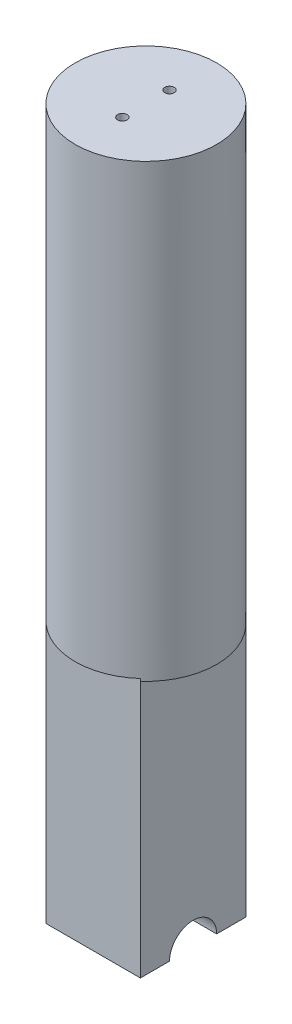
ISO-10303-21;
HEADER;
FILE_DESCRIPTION(('STEP AP214'),'2;1');
FILE_NAME('part.step','',(''),(''),'','','');
FILE_SCHEMA(('AUTOMOTIVE_DESIGN { 1 0 10303 214 1 1 1 1 }'));
ENDSEC;
DATA;
#1=APPLICATION_CONTEXT('core data for automotive mechanical design processes');
#2=APPLICATION_PROTOCOL_DEFINITION('international standard','automotive_design',2000,#1);
#3=PRODUCT_CONTEXT('',#1,'mechanical');
#4=PRODUCT('Part','Part','',(#3));
#5=PRODUCT_RELATED_PRODUCT_CATEGORY('part','',(#4));
#6=PRODUCT_DEFINITION_FORMATION('','',#4);
#7=PRODUCT_DEFINITION_CONTEXT('part definition',#1,'design');
#8=PRODUCT_DEFINITION('design','',#6,#7);
#9=PRODUCT_DEFINITION_SHAPE('','',#8);
#10=(LENGTH_UNIT() NAMED_UNIT(*) SI_UNIT(.MILLI.,.METRE.));
#11=(NAMED_UNIT(*) PLANE_ANGLE_UNIT() SI_UNIT($,.RADIAN.));
#12=(NAMED_UNIT(*) SI_UNIT($,.STERADIAN.) SOLID_ANGLE_UNIT());
#13=UNCERTAINTY_MEASURE_WITH_UNIT(LENGTH_MEASURE(1.E-05),#10,'distance_accuracy_value','');
#14=(GEOMETRIC_REPRESENTATION_CONTEXT(3) GLOBAL_UNCERTAINTY_ASSIGNED_CONTEXT((#13)) GLOBAL_UNIT_ASSIGNED_CONTEXT((#10,
#11,#12)) REPRESENTATION_CONTEXT('',''));
#15=CARTESIAN_POINT('',(0.,0.,0.));
#16=DIRECTION('',(0.,0.,1.));
#17=DIRECTION('',(1.,0.,0.));
#18=AXIS2_PLACEMENT_3D('',#15,#16,#17);
#19=CARTESIAN_POINT('',(0.,0.,0.));
#20=DIRECTION('',(0.,1.,0.));
#21=DIRECTION('',(0.,0.,1.));
#22=AXIS2_PLACEMENT_3D('',#19,#20,#21);
#23=PLANE('',#22);
#24=DIRECTION('',(0.,0.,1.));
#25=VECTOR('',#24,1.);
#26=CARTESIAN_POINT('',(-10.,0.,0.));
#27=LINE('',#26,#25);
#28=CARTESIAN_POINT('',(-10.,0.,4.99966011250106));
#29=VERTEX_POINT('',#28);
#30=CARTESIAN_POINT('',(-10.,0.,11.1803398874989));
#31=VERTEX_POINT('',#30);
#32=EDGE_CURVE('E129',#29,#31,#27,.T.);
#33=ORIENTED_EDGE('',*,*,#32,.F.);
#34=DIRECTION('',(1.,0.,0.));
#35=VECTOR('',#34,1.);
#36=CARTESIAN_POINT('',(-15.,0.,4.99966011250106));
#37=LINE('',#36,#35);
#38=CARTESIAN_POINT('',(10.,0.,4.99966011250106));
#39=VERTEX_POINT('',#38);
#40=EDGE_CURVE('E58',#29,#39,#37,.T.);
#41=ORIENTED_EDGE('',*,*,#40,.T.);
#42=DIRECTION('',(0.,0.,1.));
#43=VECTOR('',#42,1.);
#44=CARTESIAN_POINT('',(10.,0.,0.));
#45=LINE('',#44,#43);
#46=CARTESIAN_POINT('',(10.,0.,11.1803398874989));
#47=VERTEX_POINT('',#46);
#48=EDGE_CURVE('E122',#39,#47,#45,.T.);
#49=ORIENTED_EDGE('',*,*,#48,.T.);
#50=DIRECTION('',(1.,0.,0.));
#51=VECTOR('',#50,1.);
#52=CARTESIAN_POINT('',(-10.,0.,11.1803398874989));
#53=LINE('',#52,#51);
#54=EDGE_CURVE('E252',#31,#47,#53,.T.);
#55=ORIENTED_EDGE('',*,*,#54,.F.);
#56=EDGE_LOOP('',(#33,#41,#49,#55));
#57=FACE_BOUND('',#56,.T.);
#58=ADVANCED_FACE('F44',(#57),#23,.F.);
#59=CARTESIAN_POINT('',(0.,150.,0.));
#60=DIRECTION('',(0.,-1.,0.));
#61=DIRECTION('',(0.,0.,-1.));
#62=AXIS2_PLACEMENT_3D('',#59,#60,#61);
#63=CYLINDRICAL_SURFACE('',#62,15.);
#64=CARTESIAN_POINT('',(0.,150.,0.));
#65=DIRECTION('',(0.,1.,0.));
#66=DIRECTION('',(0.,0.,1.));
#67=AXIS2_PLACEMENT_3D('',#64,#65,#66);
#68=CIRCLE('',#67,15.);
#69=CARTESIAN_POINT('',(0.,150.,15.));
#70=VERTEX_POINT('',#69);
#71=EDGE_CURVE('E131',#70,#70,#68,.T.);
#72=ORIENTED_EDGE('',*,*,#71,.F.);
#73=EDGE_LOOP('',(#72));
#74=FACE_BOUND('',#73,.T.);
#75=CARTESIAN_POINT('',(0.,55.,0.));
#76=DIRECTION('',(0.,-1.,0.));
#77=DIRECTION('',(0.,0.,-1.));
#78=AXIS2_PLACEMENT_3D('',#75,#76,#77);
#79=CIRCLE('',#78,15.);
#80=CARTESIAN_POINT('',(-10.,55.,-11.1803398874989));
#81=VERTEX_POINT('',#80);
#82=CARTESIAN_POINT('',(10.,55.,-11.1803398874989));
#83=VERTEX_POINT('',#82);
#84=EDGE_CURVE('E247',#81,#83,#79,.T.);
#85=ORIENTED_EDGE('',*,*,#84,.F.);
#86=DIRECTION('',(0.,-1.,0.));
#87=VECTOR('',#86,1.);
#88=CARTESIAN_POINT('',(-10.,55.,-11.1803398874989));
#89=LINE('',#88,#87);
#90=CARTESIAN_POINT('',(-10.,54.4943570603394,-11.1803398874989));
#91=VERTEX_POINT('',#90);
#92=EDGE_CURVE('E144',#81,#91,#89,.T.);
#93=ORIENTED_EDGE('',*,*,#92,.T.);
#94=CARTESIAN_POINT('',(0.,54.4943570603394,0.));
#95=DIRECTION('',(0.,1.,0.));
#96=DIRECTION('',(0.,0.,1.));
#97=AXIS2_PLACEMENT_3D('',#94,#95,#96);
#98=CIRCLE('',#97,15.);
#99=CARTESIAN_POINT('',(-10.,54.4943570603394,11.1803398874989));
#100=VERTEX_POINT('',#99);
#101=EDGE_CURVE('E52',#91,#100,#98,.T.);
#102=ORIENTED_EDGE('',*,*,#101,.T.);
#103=DIRECTION('',(0.,-1.,0.));
#104=VECTOR('',#103,1.);
#105=CARTESIAN_POINT('',(-10.,55.,11.1803398874989));
#106=LINE('',#105,#104);
#107=CARTESIAN_POINT('',(-10.,55.,11.1803398874989));
#108=VERTEX_POINT('',#107);
#109=EDGE_CURVE('E143',#108,#100,#106,.T.);
#110=ORIENTED_EDGE('',*,*,#109,.F.);
#111=CARTESIAN_POINT('',(0.,55.,0.));
#112=DIRECTION('',(0.,-1.,0.));
#113=DIRECTION('',(0.,0.,-1.));
#114=AXIS2_PLACEMENT_3D('',#111,#112,#113);
#115=CIRCLE('',#114,15.);
#116=CARTESIAN_POINT('',(10.,55.,11.1803398874989));
#117=VERTEX_POINT('',#116);
#118=EDGE_CURVE('E161',#117,#108,#115,.T.);
#119=ORIENTED_EDGE('',*,*,#118,.F.);
#120=DIRECTION('',(0.,-1.,0.));
#121=VECTOR('',#120,1.);
#122=CARTESIAN_POINT('',(10.,55.,11.1803398874989));
#123=LINE('',#122,#121);
#124=CARTESIAN_POINT('',(10.,54.4943570603394,11.1803398874989));
#125=VERTEX_POINT('',#124);
#126=EDGE_CURVE('E246',#117,#125,#123,.T.);
#127=ORIENTED_EDGE('',*,*,#126,.T.);
#128=CARTESIAN_POINT('',(0.,54.4943570603394,0.));
#129=DIRECTION('',(0.,-1.,0.));
#130=DIRECTION('',(0.,0.,-1.));
#131=AXIS2_PLACEMENT_3D('',#128,#129,#130);
#132=CIRCLE('',#131,15.);
#133=CARTESIAN_POINT('',(10.,54.4943570603394,-11.1803398874989));
#134=VERTEX_POINT('',#133);
#135=EDGE_CURVE('E126',#134,#125,#132,.T.);
#136=ORIENTED_EDGE('',*,*,#135,.F.);
#137=DIRECTION('',(0.,-1.,0.));
#138=VECTOR('',#137,1.);
#139=CARTESIAN_POINT('',(10.,55.,-11.1803398874989));
#140=LINE('',#139,#138);
#141=EDGE_CURVE('E158',#83,#134,#140,.T.);
#142=ORIENTED_EDGE('',*,*,#141,.F.);
#143=EDGE_LOOP('',(#85,#93,#102,#110,#119,#127,#136,#142));
#144=FACE_BOUND('',#143,.T.);
#145=ADVANCED_FACE('F46',(#74,#144),#63,.T.);
#146=CARTESIAN_POINT('',(10.,0.,-11.1803398874989));
#147=VERTEX_POINT('',#146);
#148=CARTESIAN_POINT('',(10.,0.,-5.00033988749895));
#149=VERTEX_POINT('',#148);
#150=EDGE_CURVE('E120',#147,#149,#45,.T.);
#151=ORIENTED_EDGE('',*,*,#150,.T.);
#152=DIRECTION('',(1.,0.,0.));
#153=VECTOR('',#152,1.);
#154=CARTESIAN_POINT('',(-15.,0.,-5.00033988749895));
#155=LINE('',#154,#153);
#156=CARTESIAN_POINT('',(-10.,0.,-5.00033988749895));
#157=VERTEX_POINT('',#156);
#158=EDGE_CURVE('E106',#149,#157,#155,.F.);
#159=ORIENTED_EDGE('',*,*,#158,.T.);
#160=CARTESIAN_POINT('',(-10.,0.,-11.1803398874989));
#161=VERTEX_POINT('',#160);
#162=EDGE_CURVE('E135',#161,#157,#27,.T.);
#163=ORIENTED_EDGE('',*,*,#162,.F.);
#164=DIRECTION('',(-1.,0.,0.));
#165=VECTOR('',#164,1.);
#166=CARTESIAN_POINT('',(-10.,0.,-11.1803398874989));
#167=LINE('',#166,#165);
#168=EDGE_CURVE('E66',#147,#161,#167,.T.);
#169=ORIENTED_EDGE('',*,*,#168,.F.);
#170=EDGE_LOOP('',(#151,#159,#163,#169));
#171=FACE_BOUND('',#170,.T.);
#172=ADVANCED_FACE('F125',(#171),#23,.F.);
#173=CARTESIAN_POINT('',(0.,150.,0.));
#174=DIRECTION('',(0.,1.,0.));
#175=DIRECTION('',(0.,0.,1.));
#176=AXIS2_PLACEMENT_3D('',#173,#174,#175);
#177=PLANE('',#176);
#178=CARTESIAN_POINT('',(0.,150.,-5.));
#179=DIRECTION('',(0.,1.,0.));
#180=DIRECTION('',(0.,0.,1.));
#181=AXIS2_PLACEMENT_3D('',#178,#179,#180);
#182=CIRCLE('',#181,1.);
#183=CARTESIAN_POINT('',(0.,150.,-4.));
#184=VERTEX_POINT('',#183);
#185=EDGE_CURVE('E234',#184,#184,#182,.T.);
#186=ORIENTED_EDGE('',*,*,#185,.F.);
#187=EDGE_LOOP('',(#186));
#188=FACE_BOUND('',#187,.T.);
#189=CARTESIAN_POINT('',(0.,150.,5.));
#190=DIRECTION('',(0.,1.,0.));
#191=DIRECTION('',(0.,0.,1.));
#192=AXIS2_PLACEMENT_3D('',#189,#190,#191);
#193=CIRCLE('',#192,1.);
#194=CARTESIAN_POINT('',(0.,150.,6.));
#195=VERTEX_POINT('',#194);
#196=EDGE_CURVE('E237',#195,#195,#193,.T.);
#197=ORIENTED_EDGE('',*,*,#196,.F.);
#198=EDGE_LOOP('',(#197));
#199=FACE_BOUND('',#198,.T.);
#200=ORIENTED_EDGE('',*,*,#71,.T.);
#201=EDGE_LOOP('',(#200));
#202=FACE_BOUND('',#201,.T.);
#203=ADVANCED_FACE('F173',(#188,#199,#202),#177,.T.);
#204=CARTESIAN_POINT('',(110.,54.4943570603394,15.));
#205=DIRECTION('',(0.,-1.,0.));
#206=DIRECTION('',(0.,0.,-1.));
#207=AXIS2_PLACEMENT_3D('',#204,#205,#206);
#208=PLANE('',#207);
#209=ORIENTED_EDGE('',*,*,#135,.T.);
#210=DIRECTION('',(0.,0.,1.));
#211=VECTOR('',#210,1.);
#212=CARTESIAN_POINT('',(10.,54.4943570603394,15.));
#213=LINE('',#212,#211);
#214=EDGE_CURVE('E165',#134,#125,#213,.T.);
#215=ORIENTED_EDGE('',*,*,#214,.F.);
#216=EDGE_LOOP('',(#209,#215));
#217=FACE_BOUND('',#216,.T.);
#218=ADVANCED_FACE('F187',(#217),#208,.T.);
#219=CARTESIAN_POINT('',(10.,0.,0.));
#220=DIRECTION('',(-1.,0.,0.));
#221=DIRECTION('',(0.,0.,1.));
#222=AXIS2_PLACEMENT_3D('',#219,#220,#221);
#223=PLANE('',#222);
#224=ORIENTED_EDGE('',*,*,#48,.F.);
#225=CARTESIAN_POINT('',(10.,0.,-0.000339887498942634));
#226=DIRECTION('',(1.,0.,0.));
#227=DIRECTION('',(0.,0.,-1.));
#228=AXIS2_PLACEMENT_3D('',#225,#226,#227);
#229=CIRCLE('',#228,5.);
#230=EDGE_CURVE('E109',#149,#39,#229,.T.);
#231=ORIENTED_EDGE('',*,*,#230,.F.);
#232=ORIENTED_EDGE('',*,*,#150,.F.);
#233=DIRECTION('',(0.,-1.,0.));
#234=VECTOR('',#233,1.);
#235=CARTESIAN_POINT('',(10.,150.,-11.1803398874989));
#236=LINE('',#235,#234);
#237=EDGE_CURVE('E169',#134,#147,#236,.T.);
#238=ORIENTED_EDGE('',*,*,#237,.F.);
#239=ORIENTED_EDGE('',*,*,#214,.T.);
#240=DIRECTION('',(0.,-1.,0.));
#241=VECTOR('',#240,1.);
#242=CARTESIAN_POINT('',(10.,150.,11.1803398874989));
#243=LINE('',#242,#241);
#244=EDGE_CURVE('E168',#47,#125,#243,.F.);
#245=ORIENTED_EDGE('',*,*,#244,.F.);
#246=EDGE_LOOP('',(#224,#231,#232,#238,#239,#245));
#247=FACE_BOUND('',#246,.T.);
#248=ADVANCED_FACE('F118',(#247),#223,.F.);
#249=CARTESIAN_POINT('',(-110.,54.4943570603394,15.));
#250=DIRECTION('',(0.,1.,0.));
#251=DIRECTION('',(0.,0.,1.));
#252=AXIS2_PLACEMENT_3D('',#249,#250,#251);
#253=PLANE('',#252);
#254=DIRECTION('',(0.,0.,1.));
#255=VECTOR('',#254,1.);
#256=CARTESIAN_POINT('',(-10.,54.4943570603394,15.));
#257=LINE('',#256,#255);
#258=EDGE_CURVE('E149',#91,#100,#257,.T.);
#259=ORIENTED_EDGE('',*,*,#258,.T.);
#260=ORIENTED_EDGE('',*,*,#101,.F.);
#261=EDGE_LOOP('',(#259,#260));
#262=FACE_BOUND('',#261,.T.);
#263=ADVANCED_FACE('F148',(#262),#253,.F.);
#264=CARTESIAN_POINT('',(-10.,0.,0.));
#265=DIRECTION('',(-1.,0.,0.));
#266=DIRECTION('',(0.,0.,1.));
#267=AXIS2_PLACEMENT_3D('',#264,#265,#266);
#268=PLANE('',#267);
#269=CARTESIAN_POINT('',(-10.,0.,-0.000339887498942634));
#270=DIRECTION('',(-1.,0.,0.));
#271=DIRECTION('',(0.,0.,1.));
#272=AXIS2_PLACEMENT_3D('',#269,#270,#271);
#273=CIRCLE('',#272,5.);
#274=EDGE_CURVE('E12',#29,#157,#273,.T.);
#275=ORIENTED_EDGE('',*,*,#274,.F.);
#276=ORIENTED_EDGE('',*,*,#32,.T.);
#277=DIRECTION('',(0.,-1.,0.));
#278=VECTOR('',#277,1.);
#279=CARTESIAN_POINT('',(-10.,150.,11.1803398874989));
#280=LINE('',#279,#278);
#281=EDGE_CURVE('E155',#31,#100,#280,.F.);
#282=ORIENTED_EDGE('',*,*,#281,.T.);
#283=ORIENTED_EDGE('',*,*,#258,.F.);
#284=DIRECTION('',(0.,-1.,0.));
#285=VECTOR('',#284,1.);
#286=CARTESIAN_POINT('',(-10.,150.,-11.1803398874989));
#287=LINE('',#286,#285);
#288=EDGE_CURVE('E153',#91,#161,#287,.T.);
#289=ORIENTED_EDGE('',*,*,#288,.T.);
#290=ORIENTED_EDGE('',*,*,#162,.T.);
#291=EDGE_LOOP('',(#275,#276,#282,#283,#289,#290));
#292=FACE_BOUND('',#291,.T.);
#293=ADVANCED_FACE('F152',(#292),#268,.T.);
#294=CARTESIAN_POINT('',(-10.,55.,11.1803398874989));
#295=DIRECTION('',(0.,0.,-1.));
#296=DIRECTION('',(-1.,0.,0.));
#297=AXIS2_PLACEMENT_3D('',#294,#295,#296);
#298=PLANE('',#297);
#299=ORIENTED_EDGE('',*,*,#54,.T.);
#300=ORIENTED_EDGE('',*,*,#244,.T.);
#301=ORIENTED_EDGE('',*,*,#126,.F.);
#302=DIRECTION('',(1.,0.,0.));
#303=VECTOR('',#302,1.);
#304=CARTESIAN_POINT('',(-10.,55.,11.1803398874989));
#305=LINE('',#304,#303);
#306=EDGE_CURVE('E256',#108,#117,#305,.T.);
#307=ORIENTED_EDGE('',*,*,#306,.F.);
#308=ORIENTED_EDGE('',*,*,#109,.T.);
#309=ORIENTED_EDGE('',*,*,#281,.F.);
#310=EDGE_LOOP('',(#299,#300,#301,#307,#308,#309));
#311=FACE_BOUND('',#310,.T.);
#312=ADVANCED_FACE('F198',(#311),#298,.F.);
#313=CARTESIAN_POINT('',(0.,55.,0.));
#314=DIRECTION('',(0.,-1.,0.));
#315=DIRECTION('',(0.,0.,-1.));
#316=AXIS2_PLACEMENT_3D('',#313,#314,#315);
#317=PLANE('',#316);
#318=ORIENTED_EDGE('',*,*,#118,.T.);
#319=ORIENTED_EDGE('',*,*,#306,.T.);
#320=EDGE_LOOP('',(#318,#319));
#321=FACE_BOUND('',#320,.T.);
#322=ADVANCED_FACE('F199',(#321),#317,.T.);
#323=CARTESIAN_POINT('',(-10.,55.,-11.1803398874989));
#324=DIRECTION('',(0.,0.,1.));
#325=DIRECTION('',(1.,0.,0.));
#326=AXIS2_PLACEMENT_3D('',#323,#324,#325);
#327=PLANE('',#326);
#328=ORIENTED_EDGE('',*,*,#168,.T.);
#329=ORIENTED_EDGE('',*,*,#288,.F.);
#330=ORIENTED_EDGE('',*,*,#92,.F.);
#331=DIRECTION('',(-1.,0.,0.));
#332=VECTOR('',#331,1.);
#333=CARTESIAN_POINT('',(-10.,55.,-11.1803398874989));
#334=LINE('',#333,#332);
#335=EDGE_CURVE('E249',#83,#81,#334,.T.);
#336=ORIENTED_EDGE('',*,*,#335,.F.);
#337=ORIENTED_EDGE('',*,*,#141,.T.);
#338=ORIENTED_EDGE('',*,*,#237,.T.);
#339=EDGE_LOOP('',(#328,#329,#330,#336,#337,#338));
#340=FACE_BOUND('',#339,.T.);
#341=ADVANCED_FACE('F202',(#340),#327,.F.);
#342=CARTESIAN_POINT('',(0.,55.,0.));
#343=DIRECTION('',(0.,-1.,0.));
#344=DIRECTION('',(0.,0.,-1.));
#345=AXIS2_PLACEMENT_3D('',#342,#343,#344);
#346=PLANE('',#345);
#347=ORIENTED_EDGE('',*,*,#84,.T.);
#348=ORIENTED_EDGE('',*,*,#335,.T.);
#349=EDGE_LOOP('',(#347,#348));
#350=FACE_BOUND('',#349,.T.);
#351=ADVANCED_FACE('F209',(#350),#346,.T.);
#352=CARTESIAN_POINT('',(-15.,0.,-0.000339887498942634));
#353=DIRECTION('',(1.,0.,0.));
#354=DIRECTION('',(0.,0.,-1.));
#355=AXIS2_PLACEMENT_3D('',#352,#353,#354);
#356=CYLINDRICAL_SURFACE('',#355,5.);
#357=ORIENTED_EDGE('',*,*,#274,.T.);
#358=ORIENTED_EDGE('',*,*,#158,.F.);
#359=ORIENTED_EDGE('',*,*,#230,.T.);
#360=ORIENTED_EDGE('',*,*,#40,.F.);
#361=EDGE_LOOP('',(#357,#358,#359,#360));
#362=FACE_BOUND('',#361,.T.);
#363=ADVANCED_FACE('F108',(#362),#356,.F.);
#364=CARTESIAN_POINT('',(0.,142.,5.));
#365=DIRECTION('',(0.,1.,0.));
#366=DIRECTION('',(0.,0.,1.));
#367=AXIS2_PLACEMENT_3D('',#364,#365,#366);
#368=CYLINDRICAL_SURFACE('',#367,1.);
#369=CARTESIAN_POINT('',(0.,142.,5.));
#370=DIRECTION('',(0.,1.,0.));
#371=DIRECTION('',(0.,0.,1.));
#372=AXIS2_PLACEMENT_3D('',#369,#370,#371);
#373=CIRCLE('',#372,1.);
#374=CARTESIAN_POINT('',(0.,142.,6.));
#375=VERTEX_POINT('',#374);
#376=EDGE_CURVE('E242',#375,#375,#373,.T.);
#377=ORIENTED_EDGE('',*,*,#376,.F.);
#378=EDGE_LOOP('',(#377));
#379=FACE_BOUND('',#378,.T.);
#380=ORIENTED_EDGE('',*,*,#196,.T.);
#381=EDGE_LOOP('',(#380));
#382=FACE_BOUND('',#381,.T.);
#383=ADVANCED_FACE('F215',(#379,#382),#368,.F.);
#384=CARTESIAN_POINT('',(0.,142.,5.));
#385=DIRECTION('',(0.,1.,0.));
#386=DIRECTION('',(0.,0.,1.));
#387=AXIS2_PLACEMENT_3D('',#384,#385,#386);
#388=PLANE('',#387);
#389=ORIENTED_EDGE('',*,*,#376,.T.);
#390=EDGE_LOOP('',(#389));
#391=FACE_BOUND('',#390,.T.);
#392=ADVANCED_FACE('F216',(#391),#388,.T.);
#393=CARTESIAN_POINT('',(0.,142.,-5.));
#394=DIRECTION('',(0.,1.,0.));
#395=DIRECTION('',(0.,0.,1.));
#396=AXIS2_PLACEMENT_3D('',#393,#394,#395);
#397=CYLINDRICAL_SURFACE('',#396,1.);
#398=CARTESIAN_POINT('',(0.,142.,-5.));
#399=DIRECTION('',(0.,1.,0.));
#400=DIRECTION('',(0.,0.,1.));
#401=AXIS2_PLACEMENT_3D('',#398,#399,#400);
#402=CIRCLE('',#401,1.);
#403=CARTESIAN_POINT('',(0.,142.,-4.));
#404=VERTEX_POINT('',#403);
#405=EDGE_CURVE('E123',#404,#404,#402,.T.);
#406=ORIENTED_EDGE('',*,*,#405,.F.);
#407=EDGE_LOOP('',(#406));
#408=FACE_BOUND('',#407,.T.);
#409=ORIENTED_EDGE('',*,*,#185,.T.);
#410=EDGE_LOOP('',(#409));
#411=FACE_BOUND('',#410,.T.);
#412=ADVANCED_FACE('F219',(#408,#411),#397,.F.);
#413=CARTESIAN_POINT('',(0.,142.,-5.));
#414=DIRECTION('',(0.,1.,0.));
#415=DIRECTION('',(0.,0.,1.));
#416=AXIS2_PLACEMENT_3D('',#413,#414,#415);
#417=PLANE('',#416);
#418=ORIENTED_EDGE('',*,*,#405,.T.);
#419=EDGE_LOOP('',(#418));
#420=FACE_BOUND('',#419,.T.);
#421=ADVANCED_FACE('F226',(#420),#417,.T.);
#422=CLOSED_SHELL('',(#58,#145,#172,#203,#218,#248,#263,#293,#312,#322,#341,#351,#363,#383,#392,
#412,#421));
#423=MANIFOLD_SOLID_BREP('B2',#422);
#424=ADVANCED_BREP_SHAPE_REPRESENTATION('',(#18,#423),#14);
#425=SHAPE_DEFINITION_REPRESENTATION(#9,#424);
ENDSEC;
END-ISO-10303-21;
